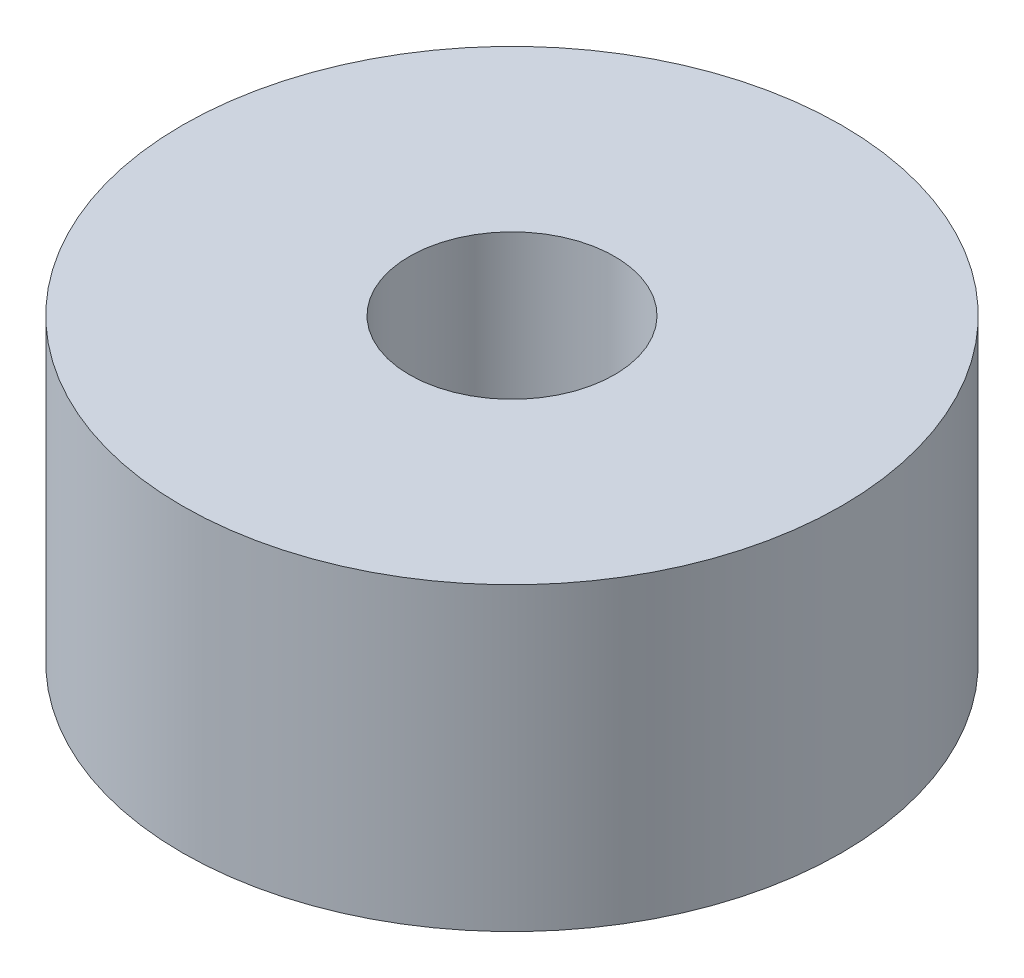
ISO-10303-21;
HEADER;
FILE_DESCRIPTION(('STEP AP214'),'2;1');
FILE_NAME('part.step','',(''),(''),'','','');
FILE_SCHEMA(('AUTOMOTIVE_DESIGN { 1 0 10303 214 1 1 1 1 }'));
ENDSEC;
DATA;
#1=APPLICATION_CONTEXT('core data for automotive mechanical design processes');
#2=APPLICATION_PROTOCOL_DEFINITION('international standard','automotive_design',2000,#1);
#3=PRODUCT_CONTEXT('',#1,'mechanical');
#4=PRODUCT('Part','Part','',(#3));
#5=PRODUCT_RELATED_PRODUCT_CATEGORY('part','',(#4));
#6=PRODUCT_DEFINITION_FORMATION('','',#4);
#7=PRODUCT_DEFINITION_CONTEXT('part definition',#1,'design');
#8=PRODUCT_DEFINITION('design','',#6,#7);
#9=PRODUCT_DEFINITION_SHAPE('','',#8);
#10=(LENGTH_UNIT() NAMED_UNIT(*) SI_UNIT(.MILLI.,.METRE.));
#11=(NAMED_UNIT(*) PLANE_ANGLE_UNIT() SI_UNIT($,.RADIAN.));
#12=(NAMED_UNIT(*) SI_UNIT($,.STERADIAN.) SOLID_ANGLE_UNIT());
#13=UNCERTAINTY_MEASURE_WITH_UNIT(LENGTH_MEASURE(1.E-05),#10,'distance_accuracy_value','');
#14=(GEOMETRIC_REPRESENTATION_CONTEXT(3) GLOBAL_UNCERTAINTY_ASSIGNED_CONTEXT((#13)) GLOBAL_UNIT_ASSIGNED_CONTEXT((#10,
#11,#12)) REPRESENTATION_CONTEXT('',''));
#15=CARTESIAN_POINT('',(0.,0.,0.));
#16=DIRECTION('',(0.,0.,1.));
#17=DIRECTION('',(1.,0.,0.));
#18=AXIS2_PLACEMENT_3D('',#15,#16,#17);
#19=CARTESIAN_POINT('',(0.,4.1,0.));
#20=DIRECTION('',(0.,1.,0.));
#21=DIRECTION('',(0.,0.,1.));
#22=AXIS2_PLACEMENT_3D('',#19,#20,#21);
#23=PLANE('',#22);
#24=CARTESIAN_POINT('',(0.,4.1,0.));
#25=DIRECTION('',(0.,1.,0.));
#26=DIRECTION('',(0.,0.,1.));
#27=AXIS2_PLACEMENT_3D('',#24,#25,#26);
#28=CIRCLE('',#27,9.00000000000001);
#29=CARTESIAN_POINT('',(0.,4.1,9.00000000000001));
#30=VERTEX_POINT('',#29);
#31=EDGE_CURVE('E10',#30,#30,#28,.T.);
#32=ORIENTED_EDGE('',*,*,#31,.T.);
#33=EDGE_LOOP('',(#32));
#34=FACE_BOUND('',#33,.T.);
#35=CARTESIAN_POINT('',(0.,4.1,0.));
#36=DIRECTION('',(0.,1.,0.));
#37=DIRECTION('',(0.,0.,1.));
#38=AXIS2_PLACEMENT_3D('',#35,#36,#37);
#39=CIRCLE('',#38,2.8);
#40=CARTESIAN_POINT('',(0.,4.1,2.8));
#41=VERTEX_POINT('',#40);
#42=EDGE_CURVE('E42',#41,#41,#39,.T.);
#43=ORIENTED_EDGE('',*,*,#42,.F.);
#44=EDGE_LOOP('',(#43));
#45=FACE_BOUND('',#44,.T.);
#46=ADVANCED_FACE('F31',(#34,#45),#23,.T.);
#47=CARTESIAN_POINT('',(0.,-4.1,0.));
#48=DIRECTION('',(0.,1.,0.));
#49=DIRECTION('',(0.,0.,1.));
#50=AXIS2_PLACEMENT_3D('',#47,#48,#49);
#51=PLANE('',#50);
#52=CARTESIAN_POINT('',(0.,-4.1,0.));
#53=DIRECTION('',(0.,1.,0.));
#54=DIRECTION('',(0.,0.,1.));
#55=AXIS2_PLACEMENT_3D('',#52,#53,#54);
#56=CIRCLE('',#55,9.00000000000001);
#57=CARTESIAN_POINT('',(0.,-4.1,9.00000000000001));
#58=VERTEX_POINT('',#57);
#59=EDGE_CURVE('E35',#58,#58,#56,.T.);
#60=ORIENTED_EDGE('',*,*,#59,.F.);
#61=EDGE_LOOP('',(#60));
#62=FACE_BOUND('',#61,.T.);
#63=CARTESIAN_POINT('',(0.,-4.1,0.));
#64=DIRECTION('',(0.,1.,0.));
#65=DIRECTION('',(0.,0.,1.));
#66=AXIS2_PLACEMENT_3D('',#63,#64,#65);
#67=CIRCLE('',#66,2.8);
#68=CARTESIAN_POINT('',(0.,-4.1,2.8));
#69=VERTEX_POINT('',#68);
#70=EDGE_CURVE('E44',#69,#69,#67,.T.);
#71=ORIENTED_EDGE('',*,*,#70,.T.);
#72=EDGE_LOOP('',(#71));
#73=FACE_BOUND('',#72,.T.);
#74=ADVANCED_FACE('F54',(#62,#73),#51,.F.);
#75=CARTESIAN_POINT('',(0.,4.1,0.));
#76=DIRECTION('',(0.,-1.,0.));
#77=DIRECTION('',(0.,0.,-1.));
#78=AXIS2_PLACEMENT_3D('',#75,#76,#77);
#79=CYLINDRICAL_SURFACE('',#78,9.00000000000001);
#80=ORIENTED_EDGE('',*,*,#31,.F.);
#81=EDGE_LOOP('',(#80));
#82=FACE_BOUND('',#81,.T.);
#83=ORIENTED_EDGE('',*,*,#59,.T.);
#84=EDGE_LOOP('',(#83));
#85=FACE_BOUND('',#84,.T.);
#86=ADVANCED_FACE('F33',(#82,#85),#79,.T.);
#87=CARTESIAN_POINT('',(0.,4.1,0.));
#88=DIRECTION('',(0.,-1.,0.));
#89=DIRECTION('',(0.,0.,-1.));
#90=AXIS2_PLACEMENT_3D('',#87,#88,#89);
#91=CYLINDRICAL_SURFACE('',#90,2.8);
#92=ORIENTED_EDGE('',*,*,#42,.T.);
#93=EDGE_LOOP('',(#92));
#94=FACE_BOUND('',#93,.T.);
#95=ORIENTED_EDGE('',*,*,#70,.F.);
#96=EDGE_LOOP('',(#95));
#97=FACE_BOUND('',#96,.T.);
#98=ADVANCED_FACE('F50',(#94,#97),#91,.F.);
#99=CLOSED_SHELL('',(#46,#74,#86,#98));
#100=MANIFOLD_SOLID_BREP('B2',#99);
#101=ADVANCED_BREP_SHAPE_REPRESENTATION('',(#18,#100),#14);
#102=SHAPE_DEFINITION_REPRESENTATION(#9,#101);
ENDSEC;
END-ISO-10303-21;
